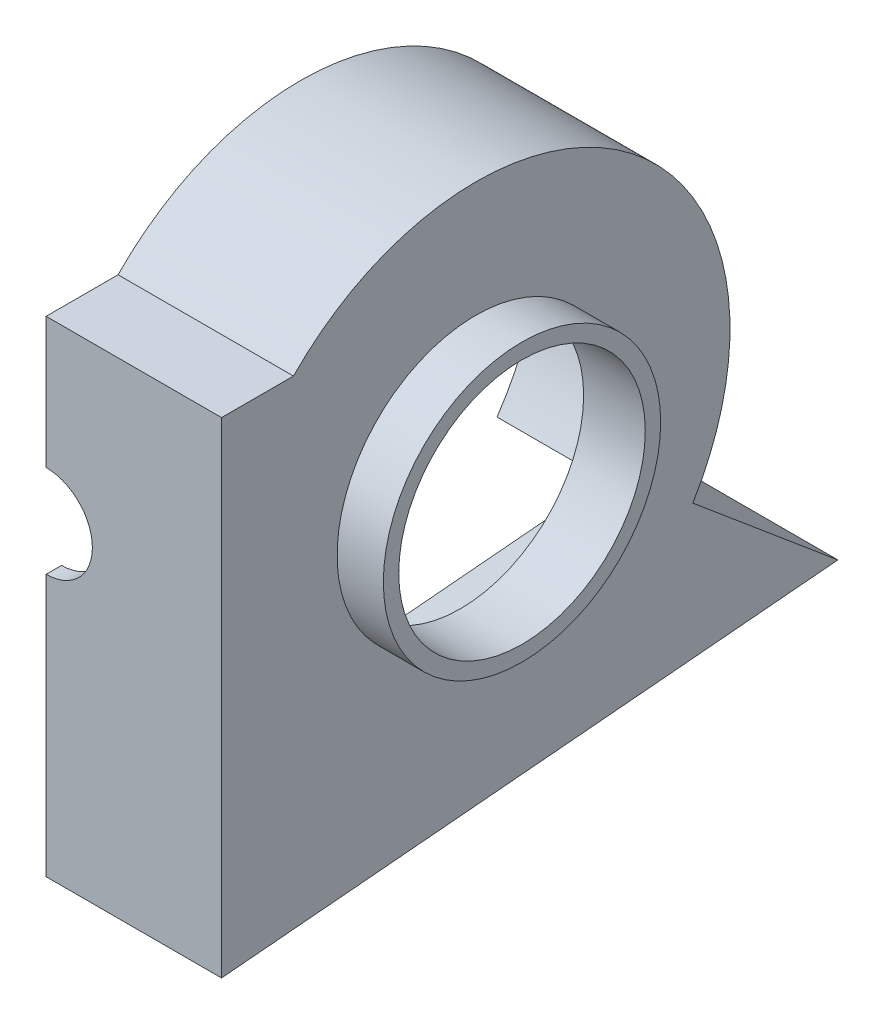
ISO-10303-21;
HEADER;
FILE_DESCRIPTION(('STEP AP214'),'2;1');
FILE_NAME('part.step','',(''),(''),'','','');
FILE_SCHEMA(('AUTOMOTIVE_DESIGN { 1 0 10303 214 1 1 1 1 }'));
ENDSEC;
DATA;
#1=APPLICATION_CONTEXT('core data for automotive mechanical design processes');
#2=APPLICATION_PROTOCOL_DEFINITION('international standard','automotive_design',2000,#1);
#3=PRODUCT_CONTEXT('',#1,'mechanical');
#4=PRODUCT('Part','Part','',(#3));
#5=PRODUCT_RELATED_PRODUCT_CATEGORY('part','',(#4));
#6=PRODUCT_DEFINITION_FORMATION('','',#4);
#7=PRODUCT_DEFINITION_CONTEXT('part definition',#1,'design');
#8=PRODUCT_DEFINITION('design','',#6,#7);
#9=PRODUCT_DEFINITION_SHAPE('','',#8);
#10=(LENGTH_UNIT() NAMED_UNIT(*) SI_UNIT(.MILLI.,.METRE.));
#11=(NAMED_UNIT(*) PLANE_ANGLE_UNIT() SI_UNIT($,.RADIAN.));
#12=(NAMED_UNIT(*) SI_UNIT($,.STERADIAN.) SOLID_ANGLE_UNIT());
#13=UNCERTAINTY_MEASURE_WITH_UNIT(LENGTH_MEASURE(1.E-05),#10,'distance_accuracy_value','');
#14=(GEOMETRIC_REPRESENTATION_CONTEXT(3) GLOBAL_UNCERTAINTY_ASSIGNED_CONTEXT((#13)) GLOBAL_UNIT_ASSIGNED_CONTEXT((#10,
#11,#12)) REPRESENTATION_CONTEXT('',''));
#15=CARTESIAN_POINT('',(0.,0.,0.));
#16=DIRECTION('',(0.,0.,1.));
#17=DIRECTION('',(1.,0.,0.));
#18=AXIS2_PLACEMENT_3D('',#15,#16,#17);
#19=CARTESIAN_POINT('',(-5.6925,35.,-20.));
#20=DIRECTION('',(1.,0.,0.));
#21=DIRECTION('',(0.,0.,1.));
#22=AXIS2_PLACEMENT_3D('',#19,#20,#21);
#23=PLANE('',#22);
#24=DIRECTION('',(0.,-1.,0.));
#25=VECTOR('',#24,1.);
#26=CARTESIAN_POINT('',(-5.6925,35.,19.));
#27=LINE('',#26,#25);
#28=CARTESIAN_POINT('',(-5.6925,13.5,19.));
#29=VERTEX_POINT('',#28);
#30=CARTESIAN_POINT('',(-5.6925,-2.40823803996742,19.));
#31=VERTEX_POINT('',#30);
#32=EDGE_CURVE('E184',#29,#31,#27,.T.);
#33=ORIENTED_EDGE('',*,*,#32,.T.);
#34=DIRECTION('',(0.,0.0871557427476514,-0.996194698091746));
#35=VECTOR('',#34,1.);
#36=CARTESIAN_POINT('',(-5.6925,1.26205902037806,-22.9516873664234));
#37=LINE('',#36,#35);
#38=CARTESIAN_POINT('',(-5.6925,0.785782121911663,-17.5078175063551));
#39=VERTEX_POINT('',#38);
#40=EDGE_CURVE('E166',#31,#39,#37,.T.);
#41=ORIENTED_EDGE('',*,*,#40,.T.);
#42=DIRECTION('',(0.,-0.642787609686538,-0.766044443118979));
#43=VECTOR('',#42,1.);
#44=CARTESIAN_POINT('',(-5.6925,13.6951124477097,-2.12307671259983));
#45=LINE('',#44,#43);
#46=CARTESIAN_POINT('',(-5.6925,7.70429056918022,-9.26266020892933));
#47=VERTEX_POINT('',#46);
#48=EDGE_CURVE('E180',#47,#39,#45,.T.);
#49=ORIENTED_EDGE('',*,*,#48,.F.);
#50=CARTESIAN_POINT('',(-5.6925,16.5,3.5));
#51=DIRECTION('',(-1.,0.,0.));
#52=DIRECTION('',(0.,0.,1.));
#53=AXIS2_PLACEMENT_3D('',#50,#51,#52);
#54=CIRCLE('',#53,15.5);
#55=CARTESIAN_POINT('',(-5.6925,27.,14.9017542509914));
#56=VERTEX_POINT('',#55);
#57=EDGE_CURVE('E161',#56,#47,#54,.T.);
#58=ORIENTED_EDGE('',*,*,#57,.F.);
#59=DIRECTION('',(0.,0.,1.));
#60=VECTOR('',#59,1.);
#61=CARTESIAN_POINT('',(-5.6925,27.,-20.));
#62=LINE('',#61,#60);
#63=CARTESIAN_POINT('',(-5.6925,27.,19.));
#64=VERTEX_POINT('',#63);
#65=EDGE_CURVE('E190',#56,#64,#62,.T.);
#66=ORIENTED_EDGE('',*,*,#65,.T.);
#67=CARTESIAN_POINT('',(-5.6925,19.5,19.));
#68=VERTEX_POINT('',#67);
#69=EDGE_CURVE('E148',#64,#68,#27,.T.);
#70=ORIENTED_EDGE('',*,*,#69,.T.);
#71=DIRECTION('',(0.,0.,1.));
#72=VECTOR('',#71,1.);
#73=CARTESIAN_POINT('',(-5.6925,19.5,13.));
#74=LINE('',#73,#72);
#75=CARTESIAN_POINT('',(-5.6925,19.5,20.));
#76=VERTEX_POINT('',#75);
#77=EDGE_CURVE('E127',#76,#68,#74,.F.);
#78=ORIENTED_EDGE('',*,*,#77,.F.);
#79=DIRECTION('',(0.,-1.,0.));
#80=VECTOR('',#79,1.);
#81=CARTESIAN_POINT('',(-5.6925,35.,20.));
#82=LINE('',#81,#80);
#83=CARTESIAN_POINT('',(-5.6925,28.,20.));
#84=VERTEX_POINT('',#83);
#85=EDGE_CURVE('E135',#84,#76,#82,.T.);
#86=ORIENTED_EDGE('',*,*,#85,.F.);
#87=DIRECTION('',(0.,0.,1.));
#88=VECTOR('',#87,1.);
#89=CARTESIAN_POINT('',(-5.6925,28.,0.));
#90=LINE('',#89,#88);
#91=CARTESIAN_POINT('',(-5.6925,28.,15.3321595661992));
#92=VERTEX_POINT('',#91);
#93=EDGE_CURVE('E207',#92,#84,#90,.T.);
#94=ORIENTED_EDGE('',*,*,#93,.F.);
#95=CARTESIAN_POINT('',(-5.6925,16.5,3.5));
#96=DIRECTION('',(-1.,0.,0.));
#97=DIRECTION('',(0.,0.,1.));
#98=AXIS2_PLACEMENT_3D('',#95,#96,#97);
#99=CIRCLE('',#98,16.5);
#100=CARTESIAN_POINT('',(-5.6925,7.90199647080288,-10.5827673172539));
#101=VERTEX_POINT('',#100);
#102=EDGE_CURVE('E204',#92,#101,#99,.T.);
#103=ORIENTED_EDGE('',*,*,#102,.T.);
#104=DIRECTION('',(0.,-0.642787609686538,-0.766044443118979));
#105=VECTOR('',#104,1.);
#106=CARTESIAN_POINT('',(-5.6925,9.84807753012207,-8.26351822333066));
#107=LINE('',#106,#105);
#108=CARTESIAN_POINT('',(-5.6925,0.,-20.));
#109=VERTEX_POINT('',#108);
#110=EDGE_CURVE('E210',#101,#109,#107,.T.);
#111=ORIENTED_EDGE('',*,*,#110,.T.);
#112=DIRECTION('',(0.,0.0871557427476513,-0.996194698091746));
#113=VECTOR('',#112,1.);
#114=CARTESIAN_POINT('',(-5.6925,0.,-20.));
#115=LINE('',#114,#113);
#116=CARTESIAN_POINT('',(-5.6925,-3.49954654103668,20.));
#117=VERTEX_POINT('',#116);
#118=EDGE_CURVE('E193',#117,#109,#115,.T.);
#119=ORIENTED_EDGE('',*,*,#118,.F.);
#120=CARTESIAN_POINT('',(-5.6925,13.5,20.));
#121=VERTEX_POINT('',#120);
#122=EDGE_CURVE('E143',#121,#117,#82,.T.);
#123=ORIENTED_EDGE('',*,*,#122,.F.);
#124=DIRECTION('',(0.,0.,1.));
#125=VECTOR('',#124,1.);
#126=CARTESIAN_POINT('',(-5.6925,13.5,13.));
#127=LINE('',#126,#125);
#128=EDGE_CURVE('E129',#29,#121,#127,.T.);
#129=ORIENTED_EDGE('',*,*,#128,.F.);
#130=EDGE_LOOP('',(#33,#41,#49,#58,#66,#70,#78,#86,#94,#103,#111,#119,#123,#129));
#131=FACE_BOUND('',#130,.T.);
#132=ADVANCED_FACE('F37',(#131),#23,.F.);
#133=CARTESIAN_POINT('',(5.6925,35.,-20.));
#134=DIRECTION('',(-1.,0.,0.));
#135=DIRECTION('',(0.,0.,-1.));
#136=AXIS2_PLACEMENT_3D('',#133,#134,#135);
#137=PLANE('',#136);
#138=CARTESIAN_POINT('',(5.6925,16.5,3.5));
#139=DIRECTION('',(1.,0.,0.));
#140=DIRECTION('',(0.,0.,-1.));
#141=AXIS2_PLACEMENT_3D('',#138,#139,#140);
#142=CIRCLE('',#141,9.00000000000001);
#143=CARTESIAN_POINT('',(5.6925,16.5,-5.50000000000001));
#144=VERTEX_POINT('',#143);
#145=EDGE_CURVE('E45',#144,#144,#142,.F.);
#146=ORIENTED_EDGE('',*,*,#145,.T.);
#147=EDGE_LOOP('',(#146));
#148=FACE_BOUND('',#147,.T.);
#149=DIRECTION('',(0.,-0.642787609686538,-0.766044443118979));
#150=VECTOR('',#149,1.);
#151=CARTESIAN_POINT('',(5.6925,9.84807753012207,-8.26351822333066));
#152=LINE('',#151,#150);
#153=CARTESIAN_POINT('',(5.6925,7.90199647080288,-10.5827673172539));
#154=VERTEX_POINT('',#153);
#155=CARTESIAN_POINT('',(5.6925,0.,-20.));
#156=VERTEX_POINT('',#155);
#157=EDGE_CURVE('E208',#154,#156,#152,.T.);
#158=ORIENTED_EDGE('',*,*,#157,.F.);
#159=CARTESIAN_POINT('',(5.6925,16.5,3.5));
#160=DIRECTION('',(-1.,0.,0.));
#161=DIRECTION('',(0.,0.,1.));
#162=AXIS2_PLACEMENT_3D('',#159,#160,#161);
#163=CIRCLE('',#162,16.5);
#164=CARTESIAN_POINT('',(5.6925,28.,15.3321595661992));
#165=VERTEX_POINT('',#164);
#166=EDGE_CURVE('E203',#165,#154,#163,.T.);
#167=ORIENTED_EDGE('',*,*,#166,.F.);
#168=DIRECTION('',(0.,0.,1.));
#169=VECTOR('',#168,1.);
#170=CARTESIAN_POINT('',(5.6925,28.,0.));
#171=LINE('',#170,#169);
#172=CARTESIAN_POINT('',(5.6925,28.,20.));
#173=VERTEX_POINT('',#172);
#174=EDGE_CURVE('E216',#165,#173,#171,.T.);
#175=ORIENTED_EDGE('',*,*,#174,.T.);
#176=DIRECTION('',(0.,-1.,0.));
#177=VECTOR('',#176,1.);
#178=CARTESIAN_POINT('',(5.6925,35.,20.));
#179=LINE('',#178,#177);
#180=CARTESIAN_POINT('',(5.6925,-3.49954654103668,20.));
#181=VERTEX_POINT('',#180);
#182=EDGE_CURVE('E142',#173,#181,#179,.T.);
#183=ORIENTED_EDGE('',*,*,#182,.T.);
#184=DIRECTION('',(0.,0.0871557427476513,-0.996194698091746));
#185=VECTOR('',#184,1.);
#186=CARTESIAN_POINT('',(5.6925,0.,-20.));
#187=LINE('',#186,#185);
#188=EDGE_CURVE('E156',#181,#156,#187,.T.);
#189=ORIENTED_EDGE('',*,*,#188,.T.);
#190=EDGE_LOOP('',(#158,#167,#175,#183,#189));
#191=FACE_BOUND('',#190,.T.);
#192=ADVANCED_FACE('F39',(#148,#191),#137,.F.);
#193=CARTESIAN_POINT('',(-5.6925,35.,20.));
#194=DIRECTION('',(0.,0.,-1.));
#195=DIRECTION('',(1.,0.,0.));
#196=AXIS2_PLACEMENT_3D('',#193,#194,#195);
#197=PLANE('',#196);
#198=ORIENTED_EDGE('',*,*,#122,.T.);
#199=DIRECTION('',(1.,0.,0.));
#200=VECTOR('',#199,1.);
#201=CARTESIAN_POINT('',(-5.6925,-3.49954654103668,20.));
#202=LINE('',#201,#200);
#203=EDGE_CURVE('E196',#117,#181,#202,.T.);
#204=ORIENTED_EDGE('',*,*,#203,.T.);
#205=ORIENTED_EDGE('',*,*,#182,.F.);
#206=DIRECTION('',(1.,0.,0.));
#207=VECTOR('',#206,1.);
#208=CARTESIAN_POINT('',(-5.6925,28.,20.));
#209=LINE('',#208,#207);
#210=EDGE_CURVE('E138',#84,#173,#209,.T.);
#211=ORIENTED_EDGE('',*,*,#210,.F.);
#212=ORIENTED_EDGE('',*,*,#85,.T.);
#213=CARTESIAN_POINT('',(-5.6925,16.5,20.));
#214=DIRECTION('',(0.,0.,-1.));
#215=DIRECTION('',(-1.,0.,0.));
#216=AXIS2_PLACEMENT_3D('',#213,#214,#215);
#217=CIRCLE('',#216,3.);
#218=EDGE_CURVE('E123',#76,#121,#217,.T.);
#219=ORIENTED_EDGE('',*,*,#218,.T.);
#220=EDGE_LOOP('',(#198,#204,#205,#211,#212,#219));
#221=FACE_BOUND('',#220,.T.);
#222=ADVANCED_FACE('F136',(#221),#197,.F.);
#223=CARTESIAN_POINT('',(-5.6925,16.5,3.5));
#224=DIRECTION('',(1.,0.,0.));
#225=DIRECTION('',(0.,0.,1.));
#226=AXIS2_PLACEMENT_3D('',#223,#224,#225);
#227=CYLINDRICAL_SURFACE('',#226,16.5);
#228=ORIENTED_EDGE('',*,*,#166,.T.);
#229=DIRECTION('',(1.,0.,0.));
#230=VECTOR('',#229,1.);
#231=CARTESIAN_POINT('',(-5.6925,7.90199647080288,-10.5827673172539));
#232=LINE('',#231,#230);
#233=EDGE_CURVE('E221',#101,#154,#232,.T.);
#234=ORIENTED_EDGE('',*,*,#233,.F.);
#235=ORIENTED_EDGE('',*,*,#102,.F.);
#236=DIRECTION('',(1.,0.,0.));
#237=VECTOR('',#236,1.);
#238=CARTESIAN_POINT('',(-5.6925,28.,15.3321595661992));
#239=LINE('',#238,#237);
#240=EDGE_CURVE('E213',#92,#165,#239,.T.);
#241=ORIENTED_EDGE('',*,*,#240,.T.);
#242=EDGE_LOOP('',(#228,#234,#235,#241));
#243=FACE_BOUND('',#242,.T.);
#244=ADVANCED_FACE('F258',(#243),#227,.T.);
#245=CARTESIAN_POINT('',(-5.6925,9.84807753012207,-8.26351822333066));
#246=DIRECTION('',(0.,0.766044443118979,-0.642787609686538));
#247=DIRECTION('',(0.,-0.642787609686538,-0.766044443118979));
#248=AXIS2_PLACEMENT_3D('',#245,#246,#247);
#249=PLANE('',#248);
#250=ORIENTED_EDGE('',*,*,#157,.T.);
#251=DIRECTION('',(1.,0.,0.));
#252=VECTOR('',#251,1.);
#253=CARTESIAN_POINT('',(-5.6925,0.,-20.));
#254=LINE('',#253,#252);
#255=EDGE_CURVE('E223',#109,#156,#254,.T.);
#256=ORIENTED_EDGE('',*,*,#255,.F.);
#257=ORIENTED_EDGE('',*,*,#110,.F.);
#258=ORIENTED_EDGE('',*,*,#233,.T.);
#259=EDGE_LOOP('',(#250,#256,#257,#258));
#260=FACE_BOUND('',#259,.T.);
#261=ADVANCED_FACE('F264',(#260),#249,.T.);
#262=CARTESIAN_POINT('',(-5.6925,28.,0.));
#263=DIRECTION('',(0.,-1.,0.));
#264=DIRECTION('',(0.,0.,1.));
#265=AXIS2_PLACEMENT_3D('',#262,#263,#264);
#266=PLANE('',#265);
#267=ORIENTED_EDGE('',*,*,#174,.F.);
#268=ORIENTED_EDGE('',*,*,#240,.F.);
#269=ORIENTED_EDGE('',*,*,#93,.T.);
#270=ORIENTED_EDGE('',*,*,#210,.T.);
#271=EDGE_LOOP('',(#267,#268,#269,#270));
#272=FACE_BOUND('',#271,.T.);
#273=ADVANCED_FACE('F269',(#272),#266,.F.);
#274=CARTESIAN_POINT('',(8.6925,16.5,3.5));
#275=DIRECTION('',(-1.,0.,0.));
#276=DIRECTION('',(0.,0.,-1.));
#277=AXIS2_PLACEMENT_3D('',#274,#275,#276);
#278=CYLINDRICAL_SURFACE('',#277,9.00000000000001);
#279=CARTESIAN_POINT('',(8.6925,16.5,3.5));
#280=DIRECTION('',(-1.,0.,0.));
#281=DIRECTION('',(0.,0.,1.));
#282=AXIS2_PLACEMENT_3D('',#279,#280,#281);
#283=CIRCLE('',#282,9.00000000000001);
#284=CARTESIAN_POINT('',(8.6925,16.5,12.5));
#285=VERTEX_POINT('',#284);
#286=EDGE_CURVE('E200',#285,#285,#283,.T.);
#287=ORIENTED_EDGE('',*,*,#286,.T.);
#288=EDGE_LOOP('',(#287));
#289=FACE_BOUND('',#288,.T.);
#290=ORIENTED_EDGE('',*,*,#145,.F.);
#291=EDGE_LOOP('',(#290));
#292=FACE_BOUND('',#291,.T.);
#293=ADVANCED_FACE('F367',(#289,#292),#278,.T.);
#294=CARTESIAN_POINT('',(8.6925,16.5,3.5));
#295=DIRECTION('',(1.,0.,0.));
#296=DIRECTION('',(0.,0.,1.));
#297=AXIS2_PLACEMENT_3D('',#294,#295,#296);
#298=PLANE('',#297);
#299=CARTESIAN_POINT('',(8.6925,16.5,3.5));
#300=DIRECTION('',(-1.,0.,0.));
#301=DIRECTION('',(0.,0.,1.));
#302=AXIS2_PLACEMENT_3D('',#299,#300,#301);
#303=CIRCLE('',#302,8.);
#304=CARTESIAN_POINT('',(8.6925,16.5,11.5));
#305=VERTEX_POINT('',#304);
#306=EDGE_CURVE('E150',#305,#305,#303,.T.);
#307=ORIENTED_EDGE('',*,*,#306,.T.);
#308=EDGE_LOOP('',(#307));
#309=FACE_BOUND('',#308,.T.);
#310=ORIENTED_EDGE('',*,*,#286,.F.);
#311=EDGE_LOOP('',(#310));
#312=FACE_BOUND('',#311,.T.);
#313=ADVANCED_FACE('F233',(#309,#312),#298,.T.);
#314=CARTESIAN_POINT('',(-5.6925,0.,-20.));
#315=DIRECTION('',(0.,0.996194698091746,0.0871557427476514));
#316=DIRECTION('',(0.,0.0871557427476514,-0.996194698091746));
#317=AXIS2_PLACEMENT_3D('',#314,#315,#316);
#318=PLANE('',#317);
#319=ORIENTED_EDGE('',*,*,#188,.F.);
#320=ORIENTED_EDGE('',*,*,#203,.F.);
#321=ORIENTED_EDGE('',*,*,#118,.T.);
#322=ORIENTED_EDGE('',*,*,#255,.T.);
#323=EDGE_LOOP('',(#319,#320,#321,#322));
#324=FACE_BOUND('',#323,.T.);
#325=ADVANCED_FACE('F282',(#324),#318,.F.);
#326=CARTESIAN_POINT('',(4.6925,35.,-20.));
#327=DIRECTION('',(-1.,0.,0.));
#328=DIRECTION('',(0.,0.,-1.));
#329=AXIS2_PLACEMENT_3D('',#326,#327,#328);
#330=PLANE('',#329);
#331=CARTESIAN_POINT('',(4.6925,16.5,3.5));
#332=DIRECTION('',(1.,0.,0.));
#333=DIRECTION('',(0.,0.,-1.));
#334=AXIS2_PLACEMENT_3D('',#331,#332,#333);
#335=CIRCLE('',#334,8.);
#336=CARTESIAN_POINT('',(4.6925,16.5,-4.5));
#337=VERTEX_POINT('',#336);
#338=EDGE_CURVE('E153',#337,#337,#335,.F.);
#339=ORIENTED_EDGE('',*,*,#338,.F.);
#340=EDGE_LOOP('',(#339));
#341=FACE_BOUND('',#340,.T.);
#342=DIRECTION('',(0.,-0.642787609686538,-0.766044443118979));
#343=VECTOR('',#342,1.);
#344=CARTESIAN_POINT('',(4.6925,9.0820330870031,-7.62073061364412));
#345=LINE('',#344,#343);
#346=CARTESIAN_POINT('',(4.6925,7.70429056918022,-9.26266020892933));
#347=VERTEX_POINT('',#346);
#348=CARTESIAN_POINT('',(4.6925,0.785782121911663,-17.5078175063551));
#349=VERTEX_POINT('',#348);
#350=EDGE_CURVE('E158',#347,#349,#345,.T.);
#351=ORIENTED_EDGE('',*,*,#350,.T.);
#352=DIRECTION('',(0.,0.0871557427476514,-0.996194698091746));
#353=VECTOR('',#352,1.);
#354=CARTESIAN_POINT('',(4.6925,0.996194698091746,-19.9128442572523));
#355=LINE('',#354,#353);
#356=CARTESIAN_POINT('',(4.6925,-2.40823803996742,19.));
#357=VERTEX_POINT('',#356);
#358=EDGE_CURVE('E163',#357,#349,#355,.T.);
#359=ORIENTED_EDGE('',*,*,#358,.F.);
#360=DIRECTION('',(0.,-1.,0.));
#361=VECTOR('',#360,1.);
#362=CARTESIAN_POINT('',(4.6925,35.,19.));
#363=LINE('',#362,#361);
#364=CARTESIAN_POINT('',(4.6925,27.,19.));
#365=VERTEX_POINT('',#364);
#366=EDGE_CURVE('E157',#365,#357,#363,.T.);
#367=ORIENTED_EDGE('',*,*,#366,.F.);
#368=DIRECTION('',(0.,0.,1.));
#369=VECTOR('',#368,1.);
#370=CARTESIAN_POINT('',(4.6925,27.,0.));
#371=LINE('',#370,#369);
#372=CARTESIAN_POINT('',(4.6925,27.,14.9017542509914));
#373=VERTEX_POINT('',#372);
#374=EDGE_CURVE('E162',#373,#365,#371,.T.);
#375=ORIENTED_EDGE('',*,*,#374,.F.);
#376=CARTESIAN_POINT('',(4.6925,16.5,3.5));
#377=DIRECTION('',(1.,0.,0.));
#378=DIRECTION('',(0.,0.,-1.));
#379=AXIS2_PLACEMENT_3D('',#376,#377,#378);
#380=CIRCLE('',#379,15.5);
#381=EDGE_CURVE('E171',#373,#347,#380,.F.);
#382=ORIENTED_EDGE('',*,*,#381,.T.);
#383=EDGE_LOOP('',(#351,#359,#367,#375,#382));
#384=FACE_BOUND('',#383,.T.);
#385=ADVANCED_FACE('F302',(#341,#384),#330,.T.);
#386=CARTESIAN_POINT('',(-5.6925,35.,19.));
#387=DIRECTION('',(0.,0.,-1.));
#388=DIRECTION('',(1.,0.,0.));
#389=AXIS2_PLACEMENT_3D('',#386,#387,#388);
#390=PLANE('',#389);
#391=CARTESIAN_POINT('',(-5.6925,16.5,19.));
#392=DIRECTION('',(0.,0.,1.));
#393=DIRECTION('',(1.,0.,0.));
#394=AXIS2_PLACEMENT_3D('',#391,#392,#393);
#395=CIRCLE('',#394,3.);
#396=EDGE_CURVE('E11',#29,#68,#395,.T.);
#397=ORIENTED_EDGE('',*,*,#396,.T.);
#398=ORIENTED_EDGE('',*,*,#69,.F.);
#399=DIRECTION('',(1.,0.,0.));
#400=VECTOR('',#399,1.);
#401=CARTESIAN_POINT('',(-5.6925,27.,19.));
#402=LINE('',#401,#400);
#403=EDGE_CURVE('E176',#64,#365,#402,.T.);
#404=ORIENTED_EDGE('',*,*,#403,.T.);
#405=ORIENTED_EDGE('',*,*,#366,.T.);
#406=DIRECTION('',(1.,0.,0.));
#407=VECTOR('',#406,1.);
#408=CARTESIAN_POINT('',(-5.6925,-2.40823803996742,19.));
#409=LINE('',#408,#407);
#410=EDGE_CURVE('E174',#31,#357,#409,.T.);
#411=ORIENTED_EDGE('',*,*,#410,.F.);
#412=ORIENTED_EDGE('',*,*,#32,.F.);
#413=EDGE_LOOP('',(#397,#398,#404,#405,#411,#412));
#414=FACE_BOUND('',#413,.T.);
#415=ADVANCED_FACE('F285',(#414),#390,.T.);
#416=CARTESIAN_POINT('',(-5.6925,16.5,3.5));
#417=DIRECTION('',(1.,0.,0.));
#418=DIRECTION('',(0.,0.,1.));
#419=AXIS2_PLACEMENT_3D('',#416,#417,#418);
#420=CYLINDRICAL_SURFACE('',#419,15.5);
#421=ORIENTED_EDGE('',*,*,#381,.F.);
#422=DIRECTION('',(1.,0.,0.));
#423=VECTOR('',#422,1.);
#424=CARTESIAN_POINT('',(-5.6925,27.,14.9017542509914));
#425=LINE('',#424,#423);
#426=EDGE_CURVE('E58',#56,#373,#425,.T.);
#427=ORIENTED_EDGE('',*,*,#426,.F.);
#428=ORIENTED_EDGE('',*,*,#57,.T.);
#429=DIRECTION('',(1.,0.,0.));
#430=VECTOR('',#429,1.);
#431=CARTESIAN_POINT('',(-5.6925,7.70429056918022,-9.26266020892933));
#432=LINE('',#431,#430);
#433=EDGE_CURVE('E178',#47,#347,#432,.T.);
#434=ORIENTED_EDGE('',*,*,#433,.T.);
#435=EDGE_LOOP('',(#421,#427,#428,#434));
#436=FACE_BOUND('',#435,.T.);
#437=ADVANCED_FACE('F293',(#436),#420,.F.);
#438=CARTESIAN_POINT('',(-5.6925,9.0820330870031,-7.62073061364412));
#439=DIRECTION('',(0.,0.766044443118979,-0.642787609686538));
#440=DIRECTION('',(0.,-0.642787609686538,-0.766044443118979));
#441=AXIS2_PLACEMENT_3D('',#438,#439,#440);
#442=PLANE('',#441);
#443=ORIENTED_EDGE('',*,*,#350,.F.);
#444=ORIENTED_EDGE('',*,*,#433,.F.);
#445=ORIENTED_EDGE('',*,*,#48,.T.);
#446=DIRECTION('',(1.,0.,0.));
#447=VECTOR('',#446,1.);
#448=CARTESIAN_POINT('',(-5.6925,0.785782121911663,-17.5078175063551));
#449=LINE('',#448,#447);
#450=EDGE_CURVE('E182',#39,#349,#449,.T.);
#451=ORIENTED_EDGE('',*,*,#450,.T.);
#452=EDGE_LOOP('',(#443,#444,#445,#451));
#453=FACE_BOUND('',#452,.T.);
#454=ADVANCED_FACE('F248',(#453),#442,.F.);
#455=CARTESIAN_POINT('',(-5.6925,27.,0.));
#456=DIRECTION('',(0.,-1.,0.));
#457=DIRECTION('',(0.,0.,1.));
#458=AXIS2_PLACEMENT_3D('',#455,#456,#457);
#459=PLANE('',#458);
#460=ORIENTED_EDGE('',*,*,#374,.T.);
#461=ORIENTED_EDGE('',*,*,#403,.F.);
#462=ORIENTED_EDGE('',*,*,#65,.F.);
#463=ORIENTED_EDGE('',*,*,#426,.T.);
#464=EDGE_LOOP('',(#460,#461,#462,#463));
#465=FACE_BOUND('',#464,.T.);
#466=ADVANCED_FACE('F239',(#465),#459,.T.);
#467=CARTESIAN_POINT('',(8.6925,16.5,3.5));
#468=DIRECTION('',(-1.,0.,0.));
#469=DIRECTION('',(0.,0.,-1.));
#470=AXIS2_PLACEMENT_3D('',#467,#468,#469);
#471=CYLINDRICAL_SURFACE('',#470,8.);
#472=ORIENTED_EDGE('',*,*,#338,.T.);
#473=EDGE_LOOP('',(#472));
#474=FACE_BOUND('',#473,.T.);
#475=ORIENTED_EDGE('',*,*,#306,.F.);
#476=EDGE_LOOP('',(#475));
#477=FACE_BOUND('',#476,.T.);
#478=ADVANCED_FACE('F236',(#474,#477),#471,.F.);
#479=CARTESIAN_POINT('',(-5.6925,0.996194698091746,-19.9128442572523));
#480=DIRECTION('',(0.,0.996194698091746,0.0871557427476514));
#481=DIRECTION('',(0.,0.0871557427476514,-0.996194698091746));
#482=AXIS2_PLACEMENT_3D('',#479,#480,#481);
#483=PLANE('',#482);
#484=ORIENTED_EDGE('',*,*,#358,.T.);
#485=ORIENTED_EDGE('',*,*,#450,.F.);
#486=ORIENTED_EDGE('',*,*,#40,.F.);
#487=ORIENTED_EDGE('',*,*,#410,.T.);
#488=EDGE_LOOP('',(#484,#485,#486,#487));
#489=FACE_BOUND('',#488,.T.);
#490=ADVANCED_FACE('F238',(#489),#483,.T.);
#491=CARTESIAN_POINT('',(-5.6925,16.5,13.));
#492=DIRECTION('',(0.,0.,1.));
#493=DIRECTION('',(-1.,0.,0.));
#494=AXIS2_PLACEMENT_3D('',#491,#492,#493);
#495=CYLINDRICAL_SURFACE('',#494,3.);
#496=ORIENTED_EDGE('',*,*,#396,.F.);
#497=ORIENTED_EDGE('',*,*,#128,.T.);
#498=ORIENTED_EDGE('',*,*,#218,.F.);
#499=ORIENTED_EDGE('',*,*,#77,.T.);
#500=EDGE_LOOP('',(#496,#497,#498,#499));
#501=FACE_BOUND('',#500,.T.);
#502=ADVANCED_FACE('F125',(#501),#495,.F.);
#503=CLOSED_SHELL('',(#132,#192,#222,#244,#261,#273,#293,#313,#325,#385,#415,#437,#454,#466,
#478,#490,#502));
#504=MANIFOLD_SOLID_BREP('B2',#503);
#505=ADVANCED_BREP_SHAPE_REPRESENTATION('',(#18,#504),#14);
#506=SHAPE_DEFINITION_REPRESENTATION(#9,#505);
ENDSEC;
END-ISO-10303-21;
